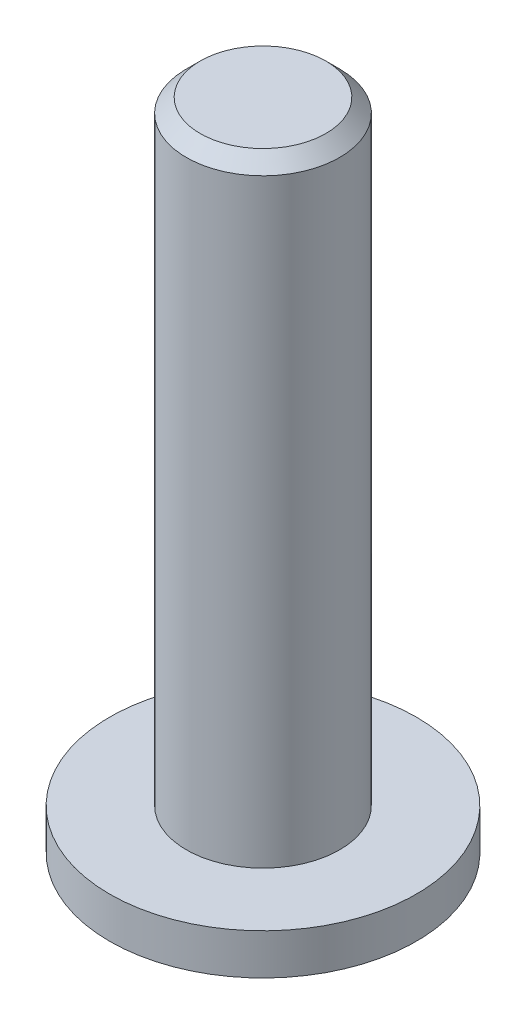
ISO-10303-21;
HEADER;
FILE_DESCRIPTION(('STEP AP214'),'2;1');
FILE_NAME('part.step','',(''),(''),'','','');
FILE_SCHEMA(('AUTOMOTIVE_DESIGN { 1 0 10303 214 1 1 1 1 }'));
ENDSEC;
DATA;
#1=APPLICATION_CONTEXT('core data for automotive mechanical design processes');
#2=APPLICATION_PROTOCOL_DEFINITION('international standard','automotive_design',2000,#1);
#3=PRODUCT_CONTEXT('',#1,'mechanical');
#4=PRODUCT('Part','Part','',(#3));
#5=PRODUCT_RELATED_PRODUCT_CATEGORY('part','',(#4));
#6=PRODUCT_DEFINITION_FORMATION('','',#4);
#7=PRODUCT_DEFINITION_CONTEXT('part definition',#1,'design');
#8=PRODUCT_DEFINITION('design','',#6,#7);
#9=PRODUCT_DEFINITION_SHAPE('','',#8);
#10=(LENGTH_UNIT() NAMED_UNIT(*) SI_UNIT(.MILLI.,.METRE.));
#11=(NAMED_UNIT(*) PLANE_ANGLE_UNIT() SI_UNIT($,.RADIAN.));
#12=(NAMED_UNIT(*) SI_UNIT($,.STERADIAN.) SOLID_ANGLE_UNIT());
#13=UNCERTAINTY_MEASURE_WITH_UNIT(LENGTH_MEASURE(1.E-05),#10,'distance_accuracy_value','');
#14=(GEOMETRIC_REPRESENTATION_CONTEXT(3) GLOBAL_UNCERTAINTY_ASSIGNED_CONTEXT((#13)) GLOBAL_UNIT_ASSIGNED_CONTEXT((#10,
#11,#12)) REPRESENTATION_CONTEXT('',''));
#15=CARTESIAN_POINT('',(0.,0.,0.));
#16=DIRECTION('',(0.,0.,1.));
#17=DIRECTION('',(1.,0.,0.));
#18=AXIS2_PLACEMENT_3D('',#15,#16,#17);
#19=CARTESIAN_POINT('',(0.,0.8,0.));
#20=DIRECTION('',(0.,-1.,0.));
#21=DIRECTION('',(0.,0.,-1.));
#22=AXIS2_PLACEMENT_3D('',#19,#20,#21);
#23=CYLINDRICAL_SURFACE('',#22,3.);
#24=CARTESIAN_POINT('',(0.,0.8,0.));
#25=DIRECTION('',(0.,1.,0.));
#26=DIRECTION('',(0.,0.,1.));
#27=AXIS2_PLACEMENT_3D('',#24,#25,#26);
#28=CIRCLE('',#27,3.);
#29=CARTESIAN_POINT('',(0.,0.8,3.));
#30=VERTEX_POINT('',#29);
#31=EDGE_CURVE('E11',#30,#30,#28,.T.);
#32=ORIENTED_EDGE('',*,*,#31,.F.);
#33=EDGE_LOOP('',(#32));
#34=FACE_BOUND('',#33,.T.);
#35=CARTESIAN_POINT('',(0.,0.,0.));
#36=DIRECTION('',(0.,1.,0.));
#37=DIRECTION('',(0.,0.,1.));
#38=AXIS2_PLACEMENT_3D('',#35,#36,#37);
#39=CIRCLE('',#38,3.);
#40=CARTESIAN_POINT('',(0.,0.,3.));
#41=VERTEX_POINT('',#40);
#42=EDGE_CURVE('E56',#41,#41,#39,.T.);
#43=ORIENTED_EDGE('',*,*,#42,.T.);
#44=EDGE_LOOP('',(#43));
#45=FACE_BOUND('',#44,.T.);
#46=ADVANCED_FACE('F53',(#34,#45),#23,.T.);
#47=CARTESIAN_POINT('',(0.,0.8,0.));
#48=DIRECTION('',(0.,1.,0.));
#49=DIRECTION('',(0.,0.,1.));
#50=AXIS2_PLACEMENT_3D('',#47,#48,#49);
#51=PLANE('',#50);
#52=CARTESIAN_POINT('',(0.,0.8,0.));
#53=DIRECTION('',(0.,-1.,0.));
#54=DIRECTION('',(0.,0.,-1.));
#55=AXIS2_PLACEMENT_3D('',#52,#53,#54);
#56=CIRCLE('',#55,1.5);
#57=CARTESIAN_POINT('',(0.,0.8,-1.5));
#58=VERTEX_POINT('',#57);
#59=EDGE_CURVE('E167',#58,#58,#56,.T.);
#60=ORIENTED_EDGE('',*,*,#59,.T.);
#61=EDGE_LOOP('',(#60));
#62=FACE_BOUND('',#61,.T.);
#63=ORIENTED_EDGE('',*,*,#31,.T.);
#64=EDGE_LOOP('',(#63));
#65=FACE_BOUND('',#64,.T.);
#66=ADVANCED_FACE('F197',(#62,#65),#51,.T.);
#67=CARTESIAN_POINT('',(0.,0.,0.));
#68=DIRECTION('',(0.,1.,0.));
#69=DIRECTION('',(0.,0.,1.));
#70=AXIS2_PLACEMENT_3D('',#67,#68,#69);
#71=PLANE('',#70);
#72=DIRECTION('',(-0.5,0.,0.866025403784438));
#73=VECTOR('',#72,1.);
#74=CARTESIAN_POINT('',(1.15470053837925,0.,0.));
#75=LINE('',#74,#73);
#76=CARTESIAN_POINT('',(1.15470053837925,0.,0.));
#77=VERTEX_POINT('',#76);
#78=CARTESIAN_POINT('',(0.577350269189625,0.,1.));
#79=VERTEX_POINT('',#78);
#80=EDGE_CURVE('E148',#77,#79,#75,.T.);
#81=ORIENTED_EDGE('',*,*,#80,.F.);
#82=DIRECTION('',(0.5,0.,0.866025403784439));
#83=VECTOR('',#82,1.);
#84=CARTESIAN_POINT('',(0.577350269189626,0.,-1.));
#85=LINE('',#84,#83);
#86=CARTESIAN_POINT('',(0.577350269189626,0.,-1.));
#87=VERTEX_POINT('',#86);
#88=EDGE_CURVE('E68',#87,#77,#85,.T.);
#89=ORIENTED_EDGE('',*,*,#88,.F.);
#90=DIRECTION('',(1.,0.,0.));
#91=VECTOR('',#90,1.);
#92=CARTESIAN_POINT('',(-0.577350269189626,0.,-1.));
#93=LINE('',#92,#91);
#94=CARTESIAN_POINT('',(-0.577350269189626,0.,-1.));
#95=VERTEX_POINT('',#94);
#96=EDGE_CURVE('E161',#95,#87,#93,.T.);
#97=ORIENTED_EDGE('',*,*,#96,.F.);
#98=DIRECTION('',(0.5,0.,-0.866025403784439));
#99=VECTOR('',#98,1.);
#100=CARTESIAN_POINT('',(-1.15470053837925,0.,0.));
#101=LINE('',#100,#99);
#102=CARTESIAN_POINT('',(-1.15470053837925,0.,0.));
#103=VERTEX_POINT('',#102);
#104=EDGE_CURVE('E158',#103,#95,#101,.T.);
#105=ORIENTED_EDGE('',*,*,#104,.F.);
#106=DIRECTION('',(-0.5,0.,-0.866025403784439));
#107=VECTOR('',#106,1.);
#108=CARTESIAN_POINT('',(-0.577350269189626,0.,1.));
#109=LINE('',#108,#107);
#110=CARTESIAN_POINT('',(-0.577350269189626,0.,1.));
#111=VERTEX_POINT('',#110);
#112=EDGE_CURVE('E116',#111,#103,#109,.T.);
#113=ORIENTED_EDGE('',*,*,#112,.F.);
#114=DIRECTION('',(-1.,0.,0.));
#115=VECTOR('',#114,1.);
#116=CARTESIAN_POINT('',(0.577350269189625,0.,1.));
#117=LINE('',#116,#115);
#118=EDGE_CURVE('E152',#79,#111,#117,.T.);
#119=ORIENTED_EDGE('',*,*,#118,.F.);
#120=EDGE_LOOP('',(#81,#89,#97,#105,#113,#119));
#121=FACE_BOUND('',#120,.T.);
#122=ORIENTED_EDGE('',*,*,#42,.F.);
#123=EDGE_LOOP('',(#122));
#124=FACE_BOUND('',#123,.T.);
#125=ADVANCED_FACE('F194',(#121,#124),#71,.F.);
#126=CARTESIAN_POINT('',(1.2295,12.8,0.));
#127=DIRECTION('',(0.,1.,0.));
#128=DIRECTION('',(0.,0.,1.));
#129=AXIS2_PLACEMENT_3D('',#126,#127,#128);
#130=PLANE('',#129);
#131=CARTESIAN_POINT('',(0.,12.8,0.));
#132=DIRECTION('',(0.,-1.,0.));
#133=DIRECTION('',(0.,0.,-1.));
#134=AXIS2_PLACEMENT_3D('',#131,#132,#133);
#135=CIRCLE('',#134,1.2295);
#136=CARTESIAN_POINT('',(0.,12.8,-1.2295));
#137=VERTEX_POINT('',#136);
#138=EDGE_CURVE('E184',#137,#137,#135,.T.);
#139=ORIENTED_EDGE('',*,*,#138,.F.);
#140=EDGE_LOOP('',(#139));
#141=FACE_BOUND('',#140,.T.);
#142=ADVANCED_FACE('F196',(#141),#130,.T.);
#143=CARTESIAN_POINT('',(0.,12.5295,0.));
#144=DIRECTION('',(0.,-1.,0.));
#145=DIRECTION('',(0.,0.,-1.));
#146=AXIS2_PLACEMENT_3D('',#143,#144,#145);
#147=CONICAL_SURFACE('',#146,1.5,0.785398163397449);
#148=ORIENTED_EDGE('',*,*,#138,.T.);
#149=EDGE_LOOP('',(#148));
#150=FACE_BOUND('',#149,.T.);
#151=CARTESIAN_POINT('',(0.,12.5295,0.));
#152=DIRECTION('',(0.,-1.,0.));
#153=DIRECTION('',(0.,0.,-1.));
#154=AXIS2_PLACEMENT_3D('',#151,#152,#153);
#155=CIRCLE('',#154,1.5);
#156=CARTESIAN_POINT('',(0.,12.5295,-1.5));
#157=VERTEX_POINT('',#156);
#158=EDGE_CURVE('E180',#157,#157,#155,.T.);
#159=ORIENTED_EDGE('',*,*,#158,.F.);
#160=EDGE_LOOP('',(#159));
#161=FACE_BOUND('',#160,.T.);
#162=ADVANCED_FACE('F204',(#150,#161),#147,.T.);
#163=CARTESIAN_POINT('',(0.,0.8,0.));
#164=DIRECTION('',(0.,-1.,0.));
#165=DIRECTION('',(0.,0.,-1.));
#166=AXIS2_PLACEMENT_3D('',#163,#164,#165);
#167=CYLINDRICAL_SURFACE('',#166,1.5);
#168=ORIENTED_EDGE('',*,*,#158,.T.);
#169=EDGE_LOOP('',(#168));
#170=FACE_BOUND('',#169,.T.);
#171=ORIENTED_EDGE('',*,*,#59,.F.);
#172=EDGE_LOOP('',(#171));
#173=FACE_BOUND('',#172,.T.);
#174=ADVANCED_FACE('F237',(#170,#173),#167,.T.);
#175=CARTESIAN_POINT('',(0.577350269189626,0.5,-1.));
#176=DIRECTION('',(0.866025403784439,0.,-0.5));
#177=DIRECTION('',(-0.5,0.,-0.866025403784439));
#178=AXIS2_PLACEMENT_3D('',#175,#176,#177);
#179=PLANE('',#178);
#180=ORIENTED_EDGE('',*,*,#88,.T.);
#181=DIRECTION('',(0.,-1.,0.));
#182=VECTOR('',#181,1.);
#183=CARTESIAN_POINT('',(1.15470053837925,0.5,0.));
#184=LINE('',#183,#182);
#185=CARTESIAN_POINT('',(1.15470053837925,0.5,0.));
#186=VERTEX_POINT('',#185);
#187=EDGE_CURVE('E98',#186,#77,#184,.T.);
#188=ORIENTED_EDGE('',*,*,#187,.F.);
#189=DIRECTION('',(0.5,0.,0.866025403784439));
#190=VECTOR('',#189,1.);
#191=CARTESIAN_POINT('',(0.577350269189626,0.5,-1.));
#192=LINE('',#191,#190);
#193=CARTESIAN_POINT('',(0.577350269189626,0.5,-1.));
#194=VERTEX_POINT('',#193);
#195=EDGE_CURVE('E164',#194,#186,#192,.T.);
#196=ORIENTED_EDGE('',*,*,#195,.F.);
#197=DIRECTION('',(0.,-1.,0.));
#198=VECTOR('',#197,1.);
#199=CARTESIAN_POINT('',(0.577350269189626,0.5,-1.));
#200=LINE('',#199,#198);
#201=EDGE_CURVE('E76',#194,#87,#200,.T.);
#202=ORIENTED_EDGE('',*,*,#201,.T.);
#203=EDGE_LOOP('',(#180,#188,#196,#202));
#204=FACE_BOUND('',#203,.T.);
#205=ADVANCED_FACE('F248',(#204),#179,.F.);
#206=CARTESIAN_POINT('',(-0.577350269189626,0.5,-1.));
#207=DIRECTION('',(0.,0.,-1.));
#208=DIRECTION('',(-1.,0.,0.));
#209=AXIS2_PLACEMENT_3D('',#206,#207,#208);
#210=PLANE('',#209);
#211=ORIENTED_EDGE('',*,*,#96,.T.);
#212=ORIENTED_EDGE('',*,*,#201,.F.);
#213=DIRECTION('',(1.,0.,0.));
#214=VECTOR('',#213,1.);
#215=CARTESIAN_POINT('',(-0.577350269189626,0.5,-1.));
#216=LINE('',#215,#214);
#217=CARTESIAN_POINT('',(-0.577350269189626,0.5,-1.));
#218=VERTEX_POINT('',#217);
#219=EDGE_CURVE('E130',#218,#194,#216,.T.);
#220=ORIENTED_EDGE('',*,*,#219,.F.);
#221=DIRECTION('',(0.,-1.,0.));
#222=VECTOR('',#221,1.);
#223=CARTESIAN_POINT('',(-0.577350269189626,0.5,-1.));
#224=LINE('',#223,#222);
#225=EDGE_CURVE('E121',#218,#95,#224,.T.);
#226=ORIENTED_EDGE('',*,*,#225,.T.);
#227=EDGE_LOOP('',(#211,#212,#220,#226));
#228=FACE_BOUND('',#227,.T.);
#229=ADVANCED_FACE('F264',(#228),#210,.F.);
#230=CARTESIAN_POINT('',(-1.15470053837925,0.5,0.));
#231=DIRECTION('',(-0.866025403784439,0.,-0.5));
#232=DIRECTION('',(-0.5,0.,0.866025403784439));
#233=AXIS2_PLACEMENT_3D('',#230,#231,#232);
#234=PLANE('',#233);
#235=ORIENTED_EDGE('',*,*,#104,.T.);
#236=ORIENTED_EDGE('',*,*,#225,.F.);
#237=DIRECTION('',(0.5,0.,-0.866025403784439));
#238=VECTOR('',#237,1.);
#239=CARTESIAN_POINT('',(-1.15470053837925,0.5,0.));
#240=LINE('',#239,#238);
#241=CARTESIAN_POINT('',(-1.15470053837925,0.5,0.));
#242=VERTEX_POINT('',#241);
#243=EDGE_CURVE('E125',#242,#218,#240,.T.);
#244=ORIENTED_EDGE('',*,*,#243,.F.);
#245=DIRECTION('',(0.,-1.,0.));
#246=VECTOR('',#245,1.);
#247=CARTESIAN_POINT('',(-1.15470053837925,0.5,0.));
#248=LINE('',#247,#246);
#249=EDGE_CURVE('E109',#242,#103,#248,.T.);
#250=ORIENTED_EDGE('',*,*,#249,.T.);
#251=EDGE_LOOP('',(#235,#236,#244,#250));
#252=FACE_BOUND('',#251,.T.);
#253=ADVANCED_FACE('F126',(#252),#234,.F.);
#254=CARTESIAN_POINT('',(-0.577350269189626,0.5,1.));
#255=DIRECTION('',(-0.866025403784439,0.,0.5));
#256=DIRECTION('',(0.5,0.,0.866025403784439));
#257=AXIS2_PLACEMENT_3D('',#254,#255,#256);
#258=PLANE('',#257);
#259=ORIENTED_EDGE('',*,*,#112,.T.);
#260=ORIENTED_EDGE('',*,*,#249,.F.);
#261=DIRECTION('',(-0.5,0.,-0.866025403784439));
#262=VECTOR('',#261,1.);
#263=CARTESIAN_POINT('',(-0.577350269189626,0.5,1.));
#264=LINE('',#263,#262);
#265=CARTESIAN_POINT('',(-0.577350269189626,0.5,1.));
#266=VERTEX_POINT('',#265);
#267=EDGE_CURVE('E113',#266,#242,#264,.T.);
#268=ORIENTED_EDGE('',*,*,#267,.F.);
#269=DIRECTION('',(0.,-1.,0.));
#270=VECTOR('',#269,1.);
#271=CARTESIAN_POINT('',(-0.577350269189626,0.5,1.));
#272=LINE('',#271,#270);
#273=EDGE_CURVE('E122',#266,#111,#272,.T.);
#274=ORIENTED_EDGE('',*,*,#273,.T.);
#275=EDGE_LOOP('',(#259,#260,#268,#274));
#276=FACE_BOUND('',#275,.T.);
#277=ADVANCED_FACE('F111',(#276),#258,.F.);
#278=CARTESIAN_POINT('',(0.577350269189625,0.5,1.));
#279=DIRECTION('',(0.,0.,1.));
#280=DIRECTION('',(1.,0.,0.));
#281=AXIS2_PLACEMENT_3D('',#278,#279,#280);
#282=PLANE('',#281);
#283=ORIENTED_EDGE('',*,*,#118,.T.);
#284=ORIENTED_EDGE('',*,*,#273,.F.);
#285=DIRECTION('',(-1.,0.,0.));
#286=VECTOR('',#285,1.);
#287=CARTESIAN_POINT('',(0.577350269189625,0.5,1.));
#288=LINE('',#287,#286);
#289=CARTESIAN_POINT('',(0.577350269189625,0.5,1.));
#290=VERTEX_POINT('',#289);
#291=EDGE_CURVE('E136',#290,#266,#288,.T.);
#292=ORIENTED_EDGE('',*,*,#291,.F.);
#293=DIRECTION('',(0.,-1.,0.));
#294=VECTOR('',#293,1.);
#295=CARTESIAN_POINT('',(0.577350269189625,0.5,1.));
#296=LINE('',#295,#294);
#297=EDGE_CURVE('E172',#290,#79,#296,.T.);
#298=ORIENTED_EDGE('',*,*,#297,.T.);
#299=EDGE_LOOP('',(#283,#284,#292,#298));
#300=FACE_BOUND('',#299,.T.);
#301=ADVANCED_FACE('F289',(#300),#282,.F.);
#302=CARTESIAN_POINT('',(1.15470053837925,0.5,0.));
#303=DIRECTION('',(0.866025403784439,0.,0.5));
#304=DIRECTION('',(0.5,0.,-0.866025403784438));
#305=AXIS2_PLACEMENT_3D('',#302,#303,#304);
#306=PLANE('',#305);
#307=ORIENTED_EDGE('',*,*,#80,.T.);
#308=ORIENTED_EDGE('',*,*,#297,.F.);
#309=DIRECTION('',(-0.5,0.,0.866025403784438));
#310=VECTOR('',#309,1.);
#311=CARTESIAN_POINT('',(1.15470053837925,0.5,0.));
#312=LINE('',#311,#310);
#313=EDGE_CURVE('E140',#186,#290,#312,.T.);
#314=ORIENTED_EDGE('',*,*,#313,.F.);
#315=ORIENTED_EDGE('',*,*,#187,.T.);
#316=EDGE_LOOP('',(#307,#308,#314,#315));
#317=FACE_BOUND('',#316,.T.);
#318=ADVANCED_FACE('F298',(#317),#306,.F.);
#319=CARTESIAN_POINT('',(0.,0.5,0.));
#320=DIRECTION('',(0.,-1.,0.));
#321=DIRECTION('',(0.,0.,-1.));
#322=AXIS2_PLACEMENT_3D('',#319,#320,#321);
#323=PLANE('',#322);
#324=ORIENTED_EDGE('',*,*,#195,.T.);
#325=ORIENTED_EDGE('',*,*,#313,.T.);
#326=ORIENTED_EDGE('',*,*,#291,.T.);
#327=ORIENTED_EDGE('',*,*,#267,.T.);
#328=ORIENTED_EDGE('',*,*,#243,.T.);
#329=ORIENTED_EDGE('',*,*,#219,.T.);
#330=EDGE_LOOP('',(#324,#325,#326,#327,#328,#329));
#331=FACE_BOUND('',#330,.T.);
#332=ADVANCED_FACE('F133',(#331),#323,.T.);
#333=CLOSED_SHELL('',(#46,#66,#125,#142,#162,#174,#205,#229,#253,#277,#301,#318,#332));
#334=MANIFOLD_SOLID_BREP('B2',#333);
#335=ADVANCED_BREP_SHAPE_REPRESENTATION('',(#18,#334),#14);
#336=SHAPE_DEFINITION_REPRESENTATION(#9,#335);
ENDSEC;
END-ISO-10303-21;
